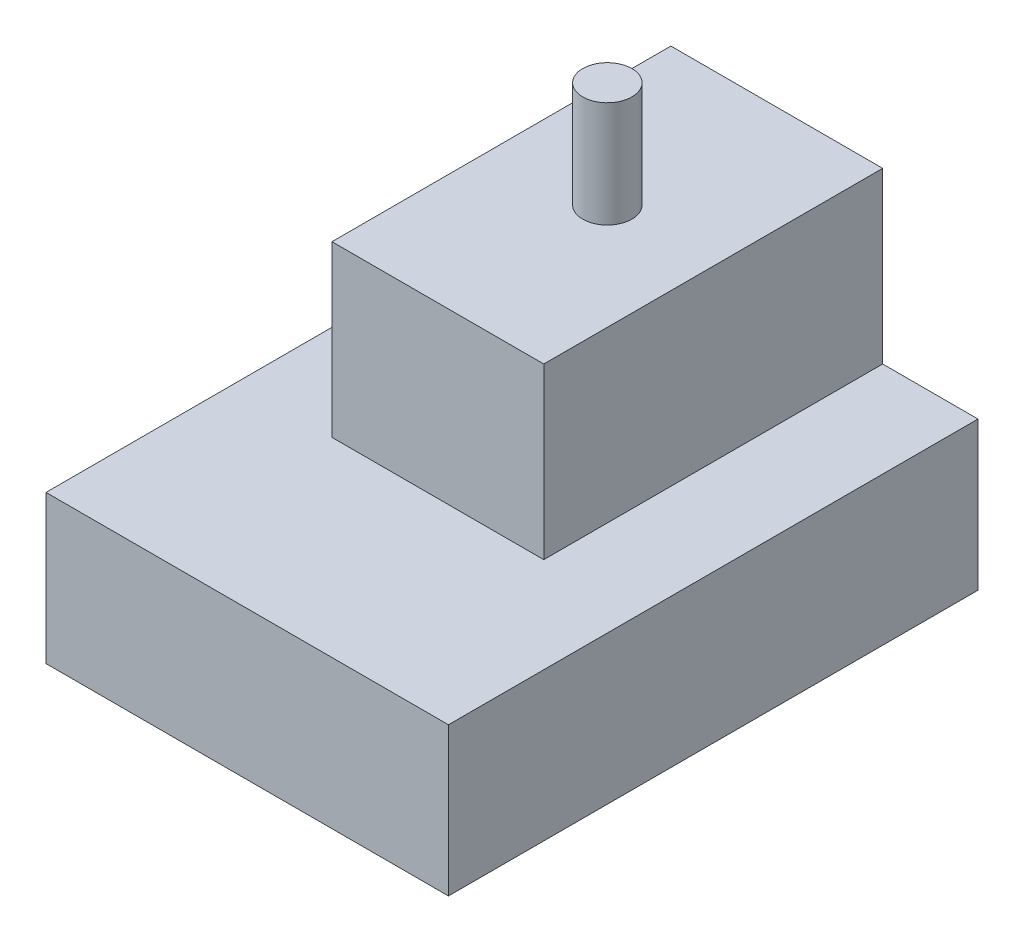
ISO-10303-21;
HEADER;
FILE_DESCRIPTION(('STEP AP214'),'2;1');
FILE_NAME('part.step','',(''),(''),'','','');
FILE_SCHEMA(('AUTOMOTIVE_DESIGN { 1 0 10303 214 1 1 1 1 }'));
ENDSEC;
DATA;
#1=APPLICATION_CONTEXT('core data for automotive mechanical design processes');
#2=APPLICATION_PROTOCOL_DEFINITION('international standard','automotive_design',2000,#1);
#3=PRODUCT_CONTEXT('',#1,'mechanical');
#4=PRODUCT('Part','Part','',(#3));
#5=PRODUCT_RELATED_PRODUCT_CATEGORY('part','',(#4));
#6=PRODUCT_DEFINITION_FORMATION('','',#4);
#7=PRODUCT_DEFINITION_CONTEXT('part definition',#1,'design');
#8=PRODUCT_DEFINITION('design','',#6,#7);
#9=PRODUCT_DEFINITION_SHAPE('','',#8);
#10=(LENGTH_UNIT() NAMED_UNIT(*) SI_UNIT(.MILLI.,.METRE.));
#11=(NAMED_UNIT(*) PLANE_ANGLE_UNIT() SI_UNIT($,.RADIAN.));
#12=(NAMED_UNIT(*) SI_UNIT($,.STERADIAN.) SOLID_ANGLE_UNIT());
#13=UNCERTAINTY_MEASURE_WITH_UNIT(LENGTH_MEASURE(1.E-05),#10,'distance_accuracy_value','');
#14=(GEOMETRIC_REPRESENTATION_CONTEXT(3) GLOBAL_UNCERTAINTY_ASSIGNED_CONTEXT((#13)) GLOBAL_UNIT_ASSIGNED_CONTEXT((#10,
#11,#12)) REPRESENTATION_CONTEXT('',''));
#15=CARTESIAN_POINT('',(0.,0.,0.));
#16=DIRECTION('',(0.,0.,1.));
#17=DIRECTION('',(1.,0.,0.));
#18=AXIS2_PLACEMENT_3D('',#15,#16,#17);
#19=CARTESIAN_POINT('',(0.,7.9375,5.08));
#20=DIRECTION('',(0.,-1.,0.));
#21=DIRECTION('',(0.,0.,-1.));
#22=AXIS2_PLACEMENT_3D('',#19,#20,#21);
#23=CYLINDRICAL_SURFACE('',#22,0.7366);
#24=CARTESIAN_POINT('',(0.,7.9375,5.08));
#25=DIRECTION('',(0.,1.,0.));
#26=DIRECTION('',(0.,0.,1.));
#27=AXIS2_PLACEMENT_3D('',#24,#25,#26);
#28=CIRCLE('',#27,0.7366);
#29=CARTESIAN_POINT('',(0.,7.9375,5.8166));
#30=VERTEX_POINT('',#29);
#31=EDGE_CURVE('E11',#30,#30,#28,.T.);
#32=ORIENTED_EDGE('',*,*,#31,.F.);
#33=EDGE_LOOP('',(#32));
#34=FACE_BOUND('',#33,.T.);
#35=CARTESIAN_POINT('',(0.,4.7625,5.08));
#36=DIRECTION('',(0.,1.,0.));
#37=DIRECTION('',(0.,0.,1.));
#38=AXIS2_PLACEMENT_3D('',#35,#36,#37);
#39=CIRCLE('',#38,0.7366);
#40=CARTESIAN_POINT('',(0.,4.7625,5.8166));
#41=VERTEX_POINT('',#40);
#42=EDGE_CURVE('E44',#41,#41,#39,.T.);
#43=ORIENTED_EDGE('',*,*,#42,.T.);
#44=EDGE_LOOP('',(#43));
#45=FACE_BOUND('',#44,.T.);
#46=ADVANCED_FACE('F41',(#34,#45),#23,.T.);
#47=CARTESIAN_POINT('',(0.,7.9375,5.08));
#48=DIRECTION('',(0.,1.,0.));
#49=DIRECTION('',(0.,0.,1.));
#50=AXIS2_PLACEMENT_3D('',#47,#48,#49);
#51=PLANE('',#50);
#52=ORIENTED_EDGE('',*,*,#31,.T.);
#53=EDGE_LOOP('',(#52));
#54=FACE_BOUND('',#53,.T.);
#55=ADVANCED_FACE('F56',(#54),#51,.T.);
#56=CARTESIAN_POINT('',(0.,4.7625,5.08));
#57=DIRECTION('',(0.,1.,0.));
#58=DIRECTION('',(0.,0.,1.));
#59=AXIS2_PLACEMENT_3D('',#56,#57,#58);
#60=PLANE('',#59);
#61=ORIENTED_EDGE('',*,*,#42,.F.);
#62=EDGE_LOOP('',(#61));
#63=FACE_BOUND('',#62,.T.);
#64=ADVANCED_FACE('F54',(#63),#60,.F.);
#65=CLOSED_SHELL('',(#46,#55,#64));
#66=MANIFOLD_SOLID_BREP('B2',#65);
#67=CARTESIAN_POINT('',(6.0325,-4.7625,15.875));
#68=DIRECTION('',(-1.,0.,0.));
#69=DIRECTION('',(0.,0.,1.));
#70=AXIS2_PLACEMENT_3D('',#67,#68,#69);
#71=PLANE('',#70);
#72=DIRECTION('',(0.,0.,-1.));
#73=VECTOR('',#72,1.);
#74=CARTESIAN_POINT('',(6.0325,-0.317500000000001,15.875));
#75=LINE('',#74,#73);
#76=CARTESIAN_POINT('',(6.0325,-0.317500000000001,15.875));
#77=VERTEX_POINT('',#76);
#78=CARTESIAN_POINT('',(6.0325,-0.317500000000001,0.));
#79=VERTEX_POINT('',#78);
#80=EDGE_CURVE('E191',#77,#79,#75,.T.);
#81=ORIENTED_EDGE('',*,*,#80,.F.);
#82=DIRECTION('',(0.,1.,0.));
#83=VECTOR('',#82,1.);
#84=CARTESIAN_POINT('',(6.0325,-4.7625,15.875));
#85=LINE('',#84,#83);
#86=CARTESIAN_POINT('',(6.0325,-4.7625,15.875));
#87=VERTEX_POINT('',#86);
#88=EDGE_CURVE('E128',#87,#77,#85,.T.);
#89=ORIENTED_EDGE('',*,*,#88,.F.);
#90=DIRECTION('',(0.,0.,-1.));
#91=VECTOR('',#90,1.);
#92=CARTESIAN_POINT('',(6.0325,-4.7625,15.875));
#93=LINE('',#92,#91);
#94=CARTESIAN_POINT('',(6.0325,-4.7625,0.));
#95=VERTEX_POINT('',#94);
#96=EDGE_CURVE('E121',#87,#95,#93,.T.);
#97=ORIENTED_EDGE('',*,*,#96,.T.);
#98=DIRECTION('',(0.,1.,0.));
#99=VECTOR('',#98,1.);
#100=CARTESIAN_POINT('',(6.0325,-4.7625,0.));
#101=LINE('',#100,#99);
#102=EDGE_CURVE('E135',#95,#79,#101,.T.);
#103=ORIENTED_EDGE('',*,*,#102,.T.);
#104=EDGE_LOOP('',(#81,#89,#97,#103));
#105=FACE_BOUND('',#104,.T.);
#106=ADVANCED_FACE('F82',(#105),#71,.F.);
#107=CARTESIAN_POINT('',(-6.0325,4.7625,15.875));
#108=DIRECTION('',(0.,-1.,0.));
#109=DIRECTION('',(0.,0.,-1.));
#110=AXIS2_PLACEMENT_3D('',#107,#108,#109);
#111=PLANE('',#110);
#112=DIRECTION('',(0.,0.,-1.));
#113=VECTOR('',#112,1.);
#114=CARTESIAN_POINT('',(3.175,4.7625,10.16));
#115=LINE('',#114,#113);
#116=CARTESIAN_POINT('',(3.175,4.7625,10.16));
#117=VERTEX_POINT('',#116);
#118=CARTESIAN_POINT('',(3.175,4.7625,0.));
#119=VERTEX_POINT('',#118);
#120=EDGE_CURVE('E252',#117,#119,#115,.T.);
#121=ORIENTED_EDGE('',*,*,#120,.T.);
#122=DIRECTION('',(-1.,0.,0.));
#123=VECTOR('',#122,1.);
#124=CARTESIAN_POINT('',(-6.0325,4.7625,0.));
#125=LINE('',#124,#123);
#126=CARTESIAN_POINT('',(-3.175,4.7625,0.));
#127=VERTEX_POINT('',#126);
#128=EDGE_CURVE('E142',#119,#127,#125,.T.);
#129=ORIENTED_EDGE('',*,*,#128,.T.);
#130=DIRECTION('',(0.,0.,1.));
#131=VECTOR('',#130,1.);
#132=CARTESIAN_POINT('',(-3.175,4.7625,10.16));
#133=LINE('',#132,#131);
#134=CARTESIAN_POINT('',(-3.175,4.7625,10.16));
#135=VERTEX_POINT('',#134);
#136=EDGE_CURVE('E96',#127,#135,#133,.T.);
#137=ORIENTED_EDGE('',*,*,#136,.T.);
#138=DIRECTION('',(1.,0.,0.));
#139=VECTOR('',#138,1.);
#140=CARTESIAN_POINT('',(-3.175,4.7625,10.16));
#141=LINE('',#140,#139);
#142=EDGE_CURVE('E199',#135,#117,#141,.T.);
#143=ORIENTED_EDGE('',*,*,#142,.T.);
#144=EDGE_LOOP('',(#121,#129,#137,#143));
#145=FACE_BOUND('',#144,.T.);
#146=ADVANCED_FACE('F221',(#145),#111,.F.);
#147=CARTESIAN_POINT('',(-6.0325,-4.7625,15.875));
#148=DIRECTION('',(1.,0.,0.));
#149=DIRECTION('',(0.,0.,-1.));
#150=AXIS2_PLACEMENT_3D('',#147,#148,#149);
#151=PLANE('',#150);
#152=DIRECTION('',(0.,0.,1.));
#153=VECTOR('',#152,1.);
#154=CARTESIAN_POINT('',(-6.0325,-0.317500000000001,15.875));
#155=LINE('',#154,#153);
#156=CARTESIAN_POINT('',(-6.0325,-0.317500000000001,0.));
#157=VERTEX_POINT('',#156);
#158=CARTESIAN_POINT('',(-6.0325,-0.317500000000001,15.875));
#159=VERTEX_POINT('',#158);
#160=EDGE_CURVE('E143',#157,#159,#155,.T.);
#161=ORIENTED_EDGE('',*,*,#160,.F.);
#162=DIRECTION('',(0.,-1.,0.));
#163=VECTOR('',#162,1.);
#164=CARTESIAN_POINT('',(-6.0325,-4.7625,0.));
#165=LINE('',#164,#163);
#166=CARTESIAN_POINT('',(-6.0325,-4.7625,0.));
#167=VERTEX_POINT('',#166);
#168=EDGE_CURVE('E129',#157,#167,#165,.T.);
#169=ORIENTED_EDGE('',*,*,#168,.T.);
#170=DIRECTION('',(0.,0.,-1.));
#171=VECTOR('',#170,1.);
#172=CARTESIAN_POINT('',(-6.0325,-4.7625,15.875));
#173=LINE('',#172,#171);
#174=CARTESIAN_POINT('',(-6.0325,-4.7625,15.875));
#175=VERTEX_POINT('',#174);
#176=EDGE_CURVE('E124',#175,#167,#173,.T.);
#177=ORIENTED_EDGE('',*,*,#176,.F.);
#178=DIRECTION('',(0.,-1.,0.));
#179=VECTOR('',#178,1.);
#180=CARTESIAN_POINT('',(-6.0325,-4.7625,15.875));
#181=LINE('',#180,#179);
#182=EDGE_CURVE('E211',#159,#175,#181,.T.);
#183=ORIENTED_EDGE('',*,*,#182,.F.);
#184=EDGE_LOOP('',(#161,#169,#177,#183));
#185=FACE_BOUND('',#184,.T.);
#186=ADVANCED_FACE('F155',(#185),#151,.F.);
#187=CARTESIAN_POINT('',(0.,0.,15.875));
#188=DIRECTION('',(0.,0.,-1.));
#189=DIRECTION('',(-1.,0.,0.));
#190=AXIS2_PLACEMENT_3D('',#187,#188,#189);
#191=PLANE('',#190);
#192=DIRECTION('',(1.,0.,0.));
#193=VECTOR('',#192,1.);
#194=CARTESIAN_POINT('',(0.,-0.317500000000001,15.875));
#195=LINE('',#194,#193);
#196=EDGE_CURVE('E148',#159,#77,#195,.T.);
#197=ORIENTED_EDGE('',*,*,#196,.F.);
#198=ORIENTED_EDGE('',*,*,#182,.T.);
#199=DIRECTION('',(1.,0.,0.));
#200=VECTOR('',#199,1.);
#201=CARTESIAN_POINT('',(-6.0325,-4.7625,15.875));
#202=LINE('',#201,#200);
#203=EDGE_CURVE('E105',#175,#87,#202,.T.);
#204=ORIENTED_EDGE('',*,*,#203,.T.);
#205=ORIENTED_EDGE('',*,*,#88,.T.);
#206=EDGE_LOOP('',(#197,#198,#204,#205));
#207=FACE_BOUND('',#206,.T.);
#208=ADVANCED_FACE('F213',(#207),#191,.F.);
#209=CARTESIAN_POINT('',(0.,0.,0.));
#210=DIRECTION('',(0.,0.,-1.));
#211=DIRECTION('',(-1.,0.,0.));
#212=AXIS2_PLACEMENT_3D('',#209,#210,#211);
#213=PLANE('',#212);
#214=ORIENTED_EDGE('',*,*,#128,.F.);
#215=DIRECTION('',(0.,1.,0.));
#216=VECTOR('',#215,1.);
#217=CARTESIAN_POINT('',(3.175,-0.317500000000001,0.));
#218=LINE('',#217,#216);
#219=CARTESIAN_POINT('',(3.175,-0.317500000000001,0.));
#220=VERTEX_POINT('',#219);
#221=EDGE_CURVE('E195',#220,#119,#218,.T.);
#222=ORIENTED_EDGE('',*,*,#221,.F.);
#223=DIRECTION('',(1.,0.,0.));
#224=VECTOR('',#223,1.);
#225=CARTESIAN_POINT('',(0.,-0.317500000000001,0.));
#226=LINE('',#225,#224);
#227=EDGE_CURVE('E89',#220,#79,#226,.T.);
#228=ORIENTED_EDGE('',*,*,#227,.T.);
#229=ORIENTED_EDGE('',*,*,#102,.F.);
#230=DIRECTION('',(1.,0.,0.));
#231=VECTOR('',#230,1.);
#232=CARTESIAN_POINT('',(-6.0325,-4.7625,0.));
#233=LINE('',#232,#231);
#234=EDGE_CURVE('E118',#167,#95,#233,.T.);
#235=ORIENTED_EDGE('',*,*,#234,.F.);
#236=ORIENTED_EDGE('',*,*,#168,.F.);
#237=CARTESIAN_POINT('',(-3.175,-0.317500000000001,0.));
#238=VERTEX_POINT('',#237);
#239=EDGE_CURVE('E39',#157,#238,#226,.T.);
#240=ORIENTED_EDGE('',*,*,#239,.T.);
#241=DIRECTION('',(0.,1.,0.));
#242=VECTOR('',#241,1.);
#243=CARTESIAN_POINT('',(-3.175,-0.317500000000001,0.));
#244=LINE('',#243,#242);
#245=EDGE_CURVE('E201',#238,#127,#244,.T.);
#246=ORIENTED_EDGE('',*,*,#245,.T.);
#247=EDGE_LOOP('',(#214,#222,#228,#229,#235,#236,#240,#246));
#248=FACE_BOUND('',#247,.T.);
#249=ADVANCED_FACE('F139',(#248),#213,.T.);
#250=CARTESIAN_POINT('',(-6.0325,-4.7625,15.875));
#251=DIRECTION('',(0.,1.,0.));
#252=DIRECTION('',(0.,0.,1.));
#253=AXIS2_PLACEMENT_3D('',#250,#251,#252);
#254=PLANE('',#253);
#255=ORIENTED_EDGE('',*,*,#234,.T.);
#256=ORIENTED_EDGE('',*,*,#96,.F.);
#257=ORIENTED_EDGE('',*,*,#203,.F.);
#258=ORIENTED_EDGE('',*,*,#176,.T.);
#259=EDGE_LOOP('',(#255,#256,#257,#258));
#260=FACE_BOUND('',#259,.T.);
#261=ADVANCED_FACE('F120',(#260),#254,.F.);
#262=CARTESIAN_POINT('',(0.,-0.317500000000001,0.));
#263=DIRECTION('',(0.,1.,0.));
#264=DIRECTION('',(0.,0.,1.));
#265=AXIS2_PLACEMENT_3D('',#262,#263,#264);
#266=PLANE('',#265);
#267=ORIENTED_EDGE('',*,*,#160,.T.);
#268=ORIENTED_EDGE('',*,*,#196,.T.);
#269=ORIENTED_EDGE('',*,*,#80,.T.);
#270=ORIENTED_EDGE('',*,*,#227,.F.);
#271=DIRECTION('',(0.,0.,-1.));
#272=VECTOR('',#271,1.);
#273=CARTESIAN_POINT('',(3.175,-0.317500000000001,10.16));
#274=LINE('',#273,#272);
#275=CARTESIAN_POINT('',(3.175,-0.317500000000001,10.16));
#276=VERTEX_POINT('',#275);
#277=EDGE_CURVE('E189',#276,#220,#274,.T.);
#278=ORIENTED_EDGE('',*,*,#277,.F.);
#279=DIRECTION('',(1.,0.,0.));
#280=VECTOR('',#279,1.);
#281=CARTESIAN_POINT('',(-3.175,-0.317500000000001,10.16));
#282=LINE('',#281,#280);
#283=CARTESIAN_POINT('',(-3.175,-0.317500000000001,10.16));
#284=VERTEX_POINT('',#283);
#285=EDGE_CURVE('E202',#284,#276,#282,.T.);
#286=ORIENTED_EDGE('',*,*,#285,.F.);
#287=DIRECTION('',(0.,0.,1.));
#288=VECTOR('',#287,1.);
#289=CARTESIAN_POINT('',(-3.175,-0.317500000000001,10.16));
#290=LINE('',#289,#288);
#291=EDGE_CURVE('E198',#238,#284,#290,.T.);
#292=ORIENTED_EDGE('',*,*,#291,.F.);
#293=ORIENTED_EDGE('',*,*,#239,.F.);
#294=EDGE_LOOP('',(#267,#268,#269,#270,#278,#286,#292,#293));
#295=FACE_BOUND('',#294,.T.);
#296=ADVANCED_FACE('F187',(#295),#266,.T.);
#297=CARTESIAN_POINT('',(3.175,-0.317500000000001,10.16));
#298=DIRECTION('',(1.,0.,0.));
#299=DIRECTION('',(0.,0.,-1.));
#300=AXIS2_PLACEMENT_3D('',#297,#298,#299);
#301=PLANE('',#300);
#302=ORIENTED_EDGE('',*,*,#120,.F.);
#303=DIRECTION('',(0.,1.,0.));
#304=VECTOR('',#303,1.);
#305=CARTESIAN_POINT('',(3.175,-0.317500000000001,10.16));
#306=LINE('',#305,#304);
#307=EDGE_CURVE('E197',#276,#117,#306,.T.);
#308=ORIENTED_EDGE('',*,*,#307,.F.);
#309=ORIENTED_EDGE('',*,*,#277,.T.);
#310=ORIENTED_EDGE('',*,*,#221,.T.);
#311=EDGE_LOOP('',(#302,#308,#309,#310));
#312=FACE_BOUND('',#311,.T.);
#313=ADVANCED_FACE('F194',(#312),#301,.T.);
#314=CARTESIAN_POINT('',(-3.175,-0.317500000000001,10.16));
#315=DIRECTION('',(0.,0.,1.));
#316=DIRECTION('',(1.,0.,0.));
#317=AXIS2_PLACEMENT_3D('',#314,#315,#316);
#318=PLANE('',#317);
#319=ORIENTED_EDGE('',*,*,#142,.F.);
#320=DIRECTION('',(0.,1.,0.));
#321=VECTOR('',#320,1.);
#322=CARTESIAN_POINT('',(-3.175,-0.317500000000001,10.16));
#323=LINE('',#322,#321);
#324=EDGE_CURVE('E204',#284,#135,#323,.T.);
#325=ORIENTED_EDGE('',*,*,#324,.F.);
#326=ORIENTED_EDGE('',*,*,#285,.T.);
#327=ORIENTED_EDGE('',*,*,#307,.T.);
#328=EDGE_LOOP('',(#319,#325,#326,#327));
#329=FACE_BOUND('',#328,.T.);
#330=ADVANCED_FACE('F239',(#329),#318,.T.);
#331=CARTESIAN_POINT('',(-3.175,-0.317500000000001,10.16));
#332=DIRECTION('',(-1.,0.,0.));
#333=DIRECTION('',(0.,0.,1.));
#334=AXIS2_PLACEMENT_3D('',#331,#332,#333);
#335=PLANE('',#334);
#336=ORIENTED_EDGE('',*,*,#136,.F.);
#337=ORIENTED_EDGE('',*,*,#245,.F.);
#338=ORIENTED_EDGE('',*,*,#291,.T.);
#339=ORIENTED_EDGE('',*,*,#324,.T.);
#340=EDGE_LOOP('',(#336,#337,#338,#339));
#341=FACE_BOUND('',#340,.T.);
#342=ADVANCED_FACE('F242',(#341),#335,.T.);
#343=CLOSED_SHELL('',(#106,#146,#186,#208,#249,#261,#296,#313,#330,#342));
#344=MANIFOLD_SOLID_BREP('B6',#343);
#345=ADVANCED_BREP_SHAPE_REPRESENTATION('',(#18,#66,#344),#14);
#346=SHAPE_DEFINITION_REPRESENTATION(#9,#345);
ENDSEC;
END-ISO-10303-21;
